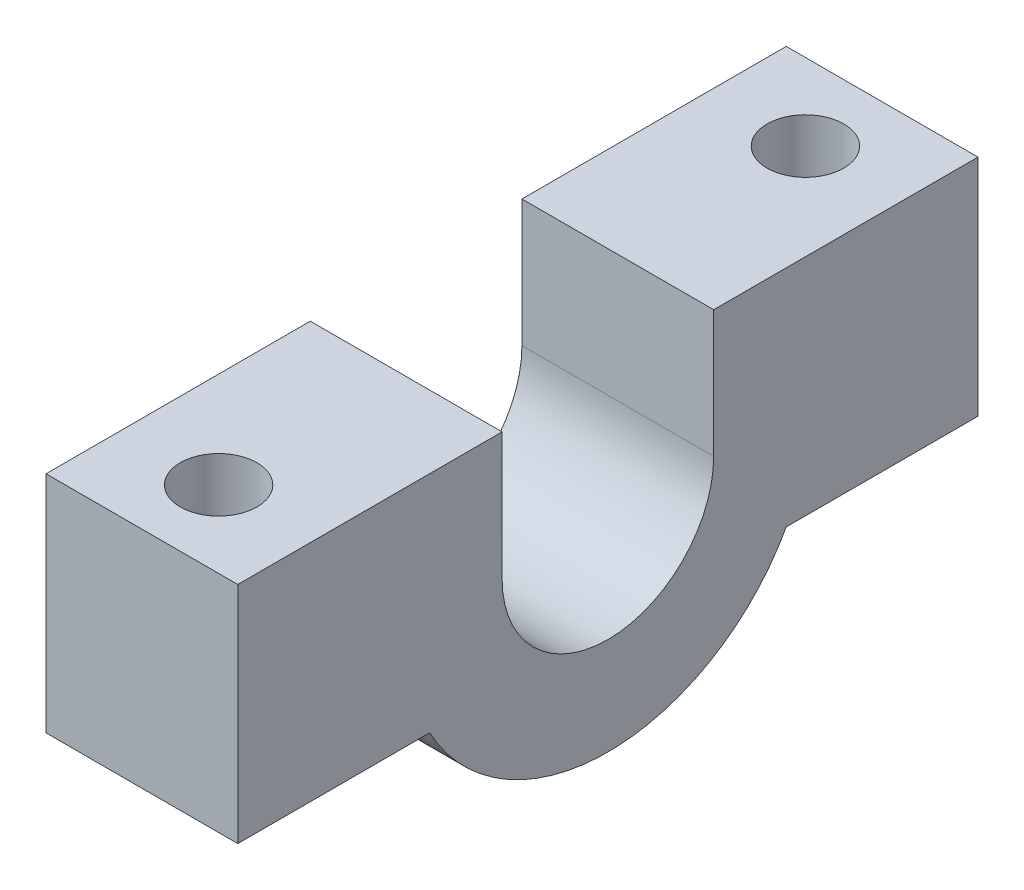
ISO-10303-21;
HEADER;
FILE_DESCRIPTION(('STEP AP214'),'2;1');
FILE_NAME('part.step','',(''),(''),'','','');
FILE_SCHEMA(('AUTOMOTIVE_DESIGN { 1 0 10303 214 1 1 1 1 }'));
ENDSEC;
DATA;
#1=APPLICATION_CONTEXT('core data for automotive mechanical design processes');
#2=APPLICATION_PROTOCOL_DEFINITION('international standard','automotive_design',2000,#1);
#3=PRODUCT_CONTEXT('',#1,'mechanical');
#4=PRODUCT('Part','Part','',(#3));
#5=PRODUCT_RELATED_PRODUCT_CATEGORY('part','',(#4));
#6=PRODUCT_DEFINITION_FORMATION('','',#4);
#7=PRODUCT_DEFINITION_CONTEXT('part definition',#1,'design');
#8=PRODUCT_DEFINITION('design','',#6,#7);
#9=PRODUCT_DEFINITION_SHAPE('','',#8);
#10=(LENGTH_UNIT() NAMED_UNIT(*) SI_UNIT(.MILLI.,.METRE.));
#11=(NAMED_UNIT(*) PLANE_ANGLE_UNIT() SI_UNIT($,.RADIAN.));
#12=(NAMED_UNIT(*) SI_UNIT($,.STERADIAN.) SOLID_ANGLE_UNIT());
#13=UNCERTAINTY_MEASURE_WITH_UNIT(LENGTH_MEASURE(1.E-05),#10,'distance_accuracy_value','');
#14=(GEOMETRIC_REPRESENTATION_CONTEXT(3) GLOBAL_UNCERTAINTY_ASSIGNED_CONTEXT((#13)) GLOBAL_UNIT_ASSIGNED_CONTEXT((#10,
#11,#12)) REPRESENTATION_CONTEXT('',''));
#15=CARTESIAN_POINT('',(0.,0.,0.));
#16=DIRECTION('',(0.,0.,1.));
#17=DIRECTION('',(1.,0.,0.));
#18=AXIS2_PLACEMENT_3D('',#15,#16,#17);
#19=CARTESIAN_POINT('',(20.,0.,0.));
#20=DIRECTION('',(-1.,0.,0.));
#21=DIRECTION('',(0.,0.,1.));
#22=AXIS2_PLACEMENT_3D('',#19,#20,#21);
#23=CYLINDRICAL_SURFACE('',#22,11.035);
#24=CARTESIAN_POINT('',(0.,0.,0.));
#25=DIRECTION('',(-1.,0.,0.));
#26=DIRECTION('',(0.,0.,-1.));
#27=AXIS2_PLACEMENT_3D('',#24,#25,#26);
#28=CIRCLE('',#27,11.035);
#29=CARTESIAN_POINT('',(0.,0.,-11.035));
#30=VERTEX_POINT('',#29);
#31=CARTESIAN_POINT('',(0.,0.,11.035));
#32=VERTEX_POINT('',#31);
#33=EDGE_CURVE('E158',#30,#32,#28,.T.);
#34=ORIENTED_EDGE('',*,*,#33,.T.);
#35=DIRECTION('',(-1.,0.,0.));
#36=VECTOR('',#35,1.);
#37=CARTESIAN_POINT('',(20.,0.,11.035));
#38=LINE('',#37,#36);
#39=CARTESIAN_POINT('',(20.,0.,11.035));
#40=VERTEX_POINT('',#39);
#41=EDGE_CURVE('E11',#40,#32,#38,.T.);
#42=ORIENTED_EDGE('',*,*,#41,.F.);
#43=CARTESIAN_POINT('',(20.,0.,0.));
#44=DIRECTION('',(-1.,0.,0.));
#45=DIRECTION('',(0.,0.,-1.));
#46=AXIS2_PLACEMENT_3D('',#43,#44,#45);
#47=CIRCLE('',#46,11.035);
#48=CARTESIAN_POINT('',(20.,0.,-11.035));
#49=VERTEX_POINT('',#48);
#50=EDGE_CURVE('E188',#49,#40,#47,.T.);
#51=ORIENTED_EDGE('',*,*,#50,.F.);
#52=DIRECTION('',(-1.,0.,0.));
#53=VECTOR('',#52,1.);
#54=CARTESIAN_POINT('',(20.,0.,-11.035));
#55=LINE('',#54,#53);
#56=EDGE_CURVE('E154',#49,#30,#55,.T.);
#57=ORIENTED_EDGE('',*,*,#56,.T.);
#58=EDGE_LOOP('',(#34,#42,#51,#57));
#59=FACE_BOUND('',#58,.T.);
#60=ADVANCED_FACE('F45',(#59),#23,.F.);
#61=CARTESIAN_POINT('',(20.,13.245,11.035));
#62=DIRECTION('',(0.,0.,1.));
#63=DIRECTION('',(1.,0.,0.));
#64=AXIS2_PLACEMENT_3D('',#61,#62,#63);
#65=PLANE('',#64);
#66=DIRECTION('',(0.,1.,0.));
#67=VECTOR('',#66,1.);
#68=CARTESIAN_POINT('',(0.,13.245,11.035));
#69=LINE('',#68,#67);
#70=CARTESIAN_POINT('',(0.,13.245,11.035));
#71=VERTEX_POINT('',#70);
#72=EDGE_CURVE('E162',#32,#71,#69,.T.);
#73=ORIENTED_EDGE('',*,*,#72,.T.);
#74=DIRECTION('',(-1.,0.,0.));
#75=VECTOR('',#74,1.);
#76=CARTESIAN_POINT('',(20.,13.245,11.035));
#77=LINE('',#76,#75);
#78=CARTESIAN_POINT('',(20.,13.245,11.035));
#79=VERTEX_POINT('',#78);
#80=EDGE_CURVE('E54',#79,#71,#77,.T.);
#81=ORIENTED_EDGE('',*,*,#80,.F.);
#82=DIRECTION('',(0.,1.,0.));
#83=VECTOR('',#82,1.);
#84=CARTESIAN_POINT('',(20.,13.245,11.035));
#85=LINE('',#84,#83);
#86=EDGE_CURVE('E111',#40,#79,#85,.T.);
#87=ORIENTED_EDGE('',*,*,#86,.F.);
#88=ORIENTED_EDGE('',*,*,#41,.T.);
#89=EDGE_LOOP('',(#73,#81,#87,#88));
#90=FACE_BOUND('',#89,.T.);
#91=ADVANCED_FACE('F269',(#90),#65,.F.);
#92=CARTESIAN_POINT('',(20.,13.245,38.6011404220279));
#93=DIRECTION('',(0.,-1.,0.));
#94=DIRECTION('',(0.,0.,-1.));
#95=AXIS2_PLACEMENT_3D('',#92,#93,#94);
#96=PLANE('',#95);
#97=CARTESIAN_POINT('',(10.,13.245,30.6));
#98=DIRECTION('',(0.,1.,0.));
#99=DIRECTION('',(0.,0.,1.));
#100=AXIS2_PLACEMENT_3D('',#97,#98,#99);
#101=CIRCLE('',#100,4.);
#102=CARTESIAN_POINT('',(10.,13.245,34.6));
#103=VERTEX_POINT('',#102);
#104=EDGE_CURVE('E253',#103,#103,#101,.T.);
#105=ORIENTED_EDGE('',*,*,#104,.F.);
#106=EDGE_LOOP('',(#105));
#107=FACE_BOUND('',#106,.T.);
#108=DIRECTION('',(0.,0.,1.));
#109=VECTOR('',#108,1.);
#110=CARTESIAN_POINT('',(0.,13.245,38.6011404220279));
#111=LINE('',#110,#109);
#112=CARTESIAN_POINT('',(0.,13.245,38.6011404220279));
#113=VERTEX_POINT('',#112);
#114=EDGE_CURVE('E166',#71,#113,#111,.T.);
#115=ORIENTED_EDGE('',*,*,#114,.T.);
#116=DIRECTION('',(-1.,0.,0.));
#117=VECTOR('',#116,1.);
#118=CARTESIAN_POINT('',(20.,13.245,38.6011404220279));
#119=LINE('',#118,#117);
#120=CARTESIAN_POINT('',(20.,13.245,38.6011404220279));
#121=VERTEX_POINT('',#120);
#122=EDGE_CURVE('E207',#121,#113,#119,.T.);
#123=ORIENTED_EDGE('',*,*,#122,.F.);
#124=DIRECTION('',(0.,0.,1.));
#125=VECTOR('',#124,1.);
#126=CARTESIAN_POINT('',(20.,13.245,38.6011404220279));
#127=LINE('',#126,#125);
#128=EDGE_CURVE('E217',#79,#121,#127,.T.);
#129=ORIENTED_EDGE('',*,*,#128,.F.);
#130=ORIENTED_EDGE('',*,*,#80,.T.);
#131=EDGE_LOOP('',(#115,#123,#129,#130));
#132=FACE_BOUND('',#131,.T.);
#133=ADVANCED_FACE('F215',(#107,#132),#96,.F.);
#134=CARTESIAN_POINT('',(20.,0.,38.6011404220279));
#135=DIRECTION('',(0.,0.,-1.));
#136=DIRECTION('',(-1.,0.,0.));
#137=AXIS2_PLACEMENT_3D('',#134,#135,#136);
#138=PLANE('',#137);
#139=DIRECTION('',(0.,-1.,0.));
#140=VECTOR('',#139,1.);
#141=CARTESIAN_POINT('',(0.,0.,38.6011404220279));
#142=LINE('',#141,#140);
#143=CARTESIAN_POINT('',(0.,-10.16,38.6011404220279));
#144=VERTEX_POINT('',#143);
#145=EDGE_CURVE('E170',#113,#144,#142,.T.);
#146=ORIENTED_EDGE('',*,*,#145,.T.);
#147=DIRECTION('',(-1.,0.,0.));
#148=VECTOR('',#147,1.);
#149=CARTESIAN_POINT('',(20.,-10.16,38.6011404220279));
#150=LINE('',#149,#148);
#151=CARTESIAN_POINT('',(20.,-10.16,38.6011404220279));
#152=VERTEX_POINT('',#151);
#153=EDGE_CURVE('E203',#152,#144,#150,.T.);
#154=ORIENTED_EDGE('',*,*,#153,.F.);
#155=DIRECTION('',(0.,-1.,0.));
#156=VECTOR('',#155,1.);
#157=CARTESIAN_POINT('',(20.,0.,38.6011404220279));
#158=LINE('',#157,#156);
#159=EDGE_CURVE('E235',#121,#152,#158,.T.);
#160=ORIENTED_EDGE('',*,*,#159,.F.);
#161=ORIENTED_EDGE('',*,*,#122,.T.);
#162=EDGE_LOOP('',(#146,#154,#160,#161));
#163=FACE_BOUND('',#162,.T.);
#164=ADVANCED_FACE('F225',(#163),#138,.F.);
#165=CARTESIAN_POINT('',(20.,-10.16,18.6011404220279));
#166=DIRECTION('',(0.,1.,0.));
#167=DIRECTION('',(0.,0.,1.));
#168=AXIS2_PLACEMENT_3D('',#165,#166,#167);
#169=PLANE('',#168);
#170=CARTESIAN_POINT('',(10.,-10.16,30.6));
#171=DIRECTION('',(0.,1.,0.));
#172=DIRECTION('',(0.,0.,1.));
#173=AXIS2_PLACEMENT_3D('',#170,#171,#172);
#174=CIRCLE('',#173,4.);
#175=CARTESIAN_POINT('',(10.,-10.16,34.6));
#176=VERTEX_POINT('',#175);
#177=EDGE_CURVE('E163',#176,#176,#174,.F.);
#178=ORIENTED_EDGE('',*,*,#177,.F.);
#179=EDGE_LOOP('',(#178));
#180=FACE_BOUND('',#179,.T.);
#181=DIRECTION('',(0.,0.,-1.));
#182=VECTOR('',#181,1.);
#183=CARTESIAN_POINT('',(0.,-10.16,18.6011404220279));
#184=LINE('',#183,#182);
#185=CARTESIAN_POINT('',(0.,-10.16,18.6011404220279));
#186=VERTEX_POINT('',#185);
#187=EDGE_CURVE('E173',#144,#186,#184,.T.);
#188=ORIENTED_EDGE('',*,*,#187,.T.);
#189=DIRECTION('',(-1.,0.,0.));
#190=VECTOR('',#189,1.);
#191=CARTESIAN_POINT('',(20.,-10.16,18.6011404220279));
#192=LINE('',#191,#190);
#193=CARTESIAN_POINT('',(20.,-10.16,18.6011404220279));
#194=VERTEX_POINT('',#193);
#195=EDGE_CURVE('E199',#194,#186,#192,.T.);
#196=ORIENTED_EDGE('',*,*,#195,.F.);
#197=DIRECTION('',(0.,0.,-1.));
#198=VECTOR('',#197,1.);
#199=CARTESIAN_POINT('',(20.,-10.16,18.6011404220279));
#200=LINE('',#199,#198);
#201=EDGE_CURVE('E231',#152,#194,#200,.T.);
#202=ORIENTED_EDGE('',*,*,#201,.F.);
#203=ORIENTED_EDGE('',*,*,#153,.T.);
#204=EDGE_LOOP('',(#188,#196,#202,#203));
#205=FACE_BOUND('',#204,.T.);
#206=ADVANCED_FACE('F229',(#180,#205),#169,.F.);
#207=CARTESIAN_POINT('',(20.,0.,0.));
#208=DIRECTION('',(-1.,0.,0.));
#209=DIRECTION('',(0.,0.,1.));
#210=AXIS2_PLACEMENT_3D('',#207,#208,#209);
#211=CYLINDRICAL_SURFACE('',#210,21.195);
#212=CARTESIAN_POINT('',(0.,0.,0.));
#213=DIRECTION('',(1.,0.,0.));
#214=DIRECTION('',(0.,0.,-1.));
#215=AXIS2_PLACEMENT_3D('',#212,#213,#214);
#216=CIRCLE('',#215,21.195);
#217=CARTESIAN_POINT('',(0.,-10.16,-18.6011404220279));
#218=VERTEX_POINT('',#217);
#219=EDGE_CURVE('E176',#186,#218,#216,.T.);
#220=ORIENTED_EDGE('',*,*,#219,.T.);
#221=DIRECTION('',(-1.,0.,0.));
#222=VECTOR('',#221,1.);
#223=CARTESIAN_POINT('',(20.,-10.16,-18.6011404220279));
#224=LINE('',#223,#222);
#225=CARTESIAN_POINT('',(20.,-10.16,-18.6011404220279));
#226=VERTEX_POINT('',#225);
#227=EDGE_CURVE('E195',#226,#218,#224,.T.);
#228=ORIENTED_EDGE('',*,*,#227,.F.);
#229=CARTESIAN_POINT('',(20.,0.,0.));
#230=DIRECTION('',(1.,0.,0.));
#231=DIRECTION('',(0.,0.,-1.));
#232=AXIS2_PLACEMENT_3D('',#229,#230,#231);
#233=CIRCLE('',#232,21.195);
#234=EDGE_CURVE('E234',#194,#226,#233,.T.);
#235=ORIENTED_EDGE('',*,*,#234,.F.);
#236=ORIENTED_EDGE('',*,*,#195,.T.);
#237=EDGE_LOOP('',(#220,#228,#235,#236));
#238=FACE_BOUND('',#237,.T.);
#239=ADVANCED_FACE('F287',(#238),#211,.T.);
#240=CARTESIAN_POINT('',(20.,-10.16,-38.6011404220279));
#241=DIRECTION('',(0.,1.,0.));
#242=DIRECTION('',(0.,0.,1.));
#243=AXIS2_PLACEMENT_3D('',#240,#241,#242);
#244=PLANE('',#243);
#245=CARTESIAN_POINT('',(10.,-10.16,-30.6));
#246=DIRECTION('',(0.,1.,0.));
#247=DIRECTION('',(0.,0.,1.));
#248=AXIS2_PLACEMENT_3D('',#245,#246,#247);
#249=CIRCLE('',#248,4.);
#250=CARTESIAN_POINT('',(10.,-10.16,-26.6));
#251=VERTEX_POINT('',#250);
#252=EDGE_CURVE('E254',#251,#251,#249,.F.);
#253=ORIENTED_EDGE('',*,*,#252,.F.);
#254=EDGE_LOOP('',(#253));
#255=FACE_BOUND('',#254,.T.);
#256=DIRECTION('',(0.,0.,-1.));
#257=VECTOR('',#256,1.);
#258=CARTESIAN_POINT('',(0.,-10.16,-38.6011404220279));
#259=LINE('',#258,#257);
#260=CARTESIAN_POINT('',(0.,-10.16,-38.6011404220279));
#261=VERTEX_POINT('',#260);
#262=EDGE_CURVE('E179',#218,#261,#259,.T.);
#263=ORIENTED_EDGE('',*,*,#262,.T.);
#264=DIRECTION('',(-1.,0.,0.));
#265=VECTOR('',#264,1.);
#266=CARTESIAN_POINT('',(20.,-10.16,-38.6011404220279));
#267=LINE('',#266,#265);
#268=CARTESIAN_POINT('',(20.,-10.16,-38.6011404220279));
#269=VERTEX_POINT('',#268);
#270=EDGE_CURVE('E147',#269,#261,#267,.T.);
#271=ORIENTED_EDGE('',*,*,#270,.F.);
#272=DIRECTION('',(0.,0.,-1.));
#273=VECTOR('',#272,1.);
#274=CARTESIAN_POINT('',(20.,-10.16,-38.6011404220279));
#275=LINE('',#274,#273);
#276=EDGE_CURVE('E136',#226,#269,#275,.T.);
#277=ORIENTED_EDGE('',*,*,#276,.F.);
#278=ORIENTED_EDGE('',*,*,#227,.T.);
#279=EDGE_LOOP('',(#263,#271,#277,#278));
#280=FACE_BOUND('',#279,.T.);
#281=ADVANCED_FACE('F284',(#255,#280),#244,.F.);
#282=CARTESIAN_POINT('',(20.,13.245,-38.6011404220279));
#283=DIRECTION('',(0.,0.,1.));
#284=DIRECTION('',(1.,0.,0.));
#285=AXIS2_PLACEMENT_3D('',#282,#283,#284);
#286=PLANE('',#285);
#287=DIRECTION('',(0.,1.,0.));
#288=VECTOR('',#287,1.);
#289=CARTESIAN_POINT('',(0.,13.245,-38.6011404220279));
#290=LINE('',#289,#288);
#291=CARTESIAN_POINT('',(0.,13.245,-38.6011404220279));
#292=VERTEX_POINT('',#291);
#293=EDGE_CURVE('E145',#261,#292,#290,.T.);
#294=ORIENTED_EDGE('',*,*,#293,.T.);
#295=DIRECTION('',(-1.,0.,0.));
#296=VECTOR('',#295,1.);
#297=CARTESIAN_POINT('',(20.,13.245,-38.6011404220279));
#298=LINE('',#297,#296);
#299=CARTESIAN_POINT('',(20.,13.245,-38.6011404220279));
#300=VERTEX_POINT('',#299);
#301=EDGE_CURVE('E142',#300,#292,#298,.T.);
#302=ORIENTED_EDGE('',*,*,#301,.F.);
#303=DIRECTION('',(0.,1.,0.));
#304=VECTOR('',#303,1.);
#305=CARTESIAN_POINT('',(20.,13.245,-38.6011404220279));
#306=LINE('',#305,#304);
#307=EDGE_CURVE('E130',#269,#300,#306,.T.);
#308=ORIENTED_EDGE('',*,*,#307,.F.);
#309=ORIENTED_EDGE('',*,*,#270,.T.);
#310=EDGE_LOOP('',(#294,#302,#308,#309));
#311=FACE_BOUND('',#310,.T.);
#312=ADVANCED_FACE('F143',(#311),#286,.F.);
#313=CARTESIAN_POINT('',(20.,13.245,-11.035));
#314=DIRECTION('',(0.,-1.,0.));
#315=DIRECTION('',(0.,0.,-1.));
#316=AXIS2_PLACEMENT_3D('',#313,#314,#315);
#317=PLANE('',#316);
#318=CARTESIAN_POINT('',(10.,13.245,-30.6));
#319=DIRECTION('',(0.,1.,0.));
#320=DIRECTION('',(0.,0.,1.));
#321=AXIS2_PLACEMENT_3D('',#318,#319,#320);
#322=CIRCLE('',#321,4.);
#323=CARTESIAN_POINT('',(10.,13.245,-26.6));
#324=VERTEX_POINT('',#323);
#325=EDGE_CURVE('E249',#324,#324,#322,.T.);
#326=ORIENTED_EDGE('',*,*,#325,.F.);
#327=EDGE_LOOP('',(#326));
#328=FACE_BOUND('',#327,.T.);
#329=DIRECTION('',(0.,0.,1.));
#330=VECTOR('',#329,1.);
#331=CARTESIAN_POINT('',(0.,13.245,-11.035));
#332=LINE('',#331,#330);
#333=CARTESIAN_POINT('',(0.,13.245,-11.035));
#334=VERTEX_POINT('',#333);
#335=EDGE_CURVE('E97',#292,#334,#332,.T.);
#336=ORIENTED_EDGE('',*,*,#335,.T.);
#337=DIRECTION('',(-1.,0.,0.));
#338=VECTOR('',#337,1.);
#339=CARTESIAN_POINT('',(20.,13.245,-11.035));
#340=LINE('',#339,#338);
#341=CARTESIAN_POINT('',(20.,13.245,-11.035));
#342=VERTEX_POINT('',#341);
#343=EDGE_CURVE('E148',#342,#334,#340,.T.);
#344=ORIENTED_EDGE('',*,*,#343,.F.);
#345=DIRECTION('',(0.,0.,1.));
#346=VECTOR('',#345,1.);
#347=CARTESIAN_POINT('',(20.,13.245,-11.035));
#348=LINE('',#347,#346);
#349=EDGE_CURVE('E134',#300,#342,#348,.T.);
#350=ORIENTED_EDGE('',*,*,#349,.F.);
#351=ORIENTED_EDGE('',*,*,#301,.T.);
#352=EDGE_LOOP('',(#336,#344,#350,#351));
#353=FACE_BOUND('',#352,.T.);
#354=ADVANCED_FACE('F150',(#328,#353),#317,.F.);
#355=CARTESIAN_POINT('',(20.,0.,-11.035));
#356=DIRECTION('',(0.,0.,-1.));
#357=DIRECTION('',(-1.,0.,0.));
#358=AXIS2_PLACEMENT_3D('',#355,#356,#357);
#359=PLANE('',#358);
#360=DIRECTION('',(0.,-1.,0.));
#361=VECTOR('',#360,1.);
#362=CARTESIAN_POINT('',(0.,0.,-11.035));
#363=LINE('',#362,#361);
#364=EDGE_CURVE('E103',#334,#30,#363,.T.);
#365=ORIENTED_EDGE('',*,*,#364,.T.);
#366=ORIENTED_EDGE('',*,*,#56,.F.);
#367=DIRECTION('',(0.,-1.,0.));
#368=VECTOR('',#367,1.);
#369=CARTESIAN_POINT('',(20.,0.,-11.035));
#370=LINE('',#369,#368);
#371=EDGE_CURVE('E62',#342,#49,#370,.T.);
#372=ORIENTED_EDGE('',*,*,#371,.F.);
#373=ORIENTED_EDGE('',*,*,#343,.T.);
#374=EDGE_LOOP('',(#365,#366,#372,#373));
#375=FACE_BOUND('',#374,.T.);
#376=ADVANCED_FACE('F303',(#375),#359,.F.);
#377=CARTESIAN_POINT('',(20.,0.,0.));
#378=DIRECTION('',(1.,0.,0.));
#379=DIRECTION('',(0.,0.,-1.));
#380=AXIS2_PLACEMENT_3D('',#377,#378,#379);
#381=PLANE('',#380);
#382=ORIENTED_EDGE('',*,*,#50,.T.);
#383=ORIENTED_EDGE('',*,*,#86,.T.);
#384=ORIENTED_EDGE('',*,*,#128,.T.);
#385=ORIENTED_EDGE('',*,*,#159,.T.);
#386=ORIENTED_EDGE('',*,*,#201,.T.);
#387=ORIENTED_EDGE('',*,*,#234,.T.);
#388=ORIENTED_EDGE('',*,*,#276,.T.);
#389=ORIENTED_EDGE('',*,*,#307,.T.);
#390=ORIENTED_EDGE('',*,*,#349,.T.);
#391=ORIENTED_EDGE('',*,*,#371,.T.);
#392=EDGE_LOOP('',(#382,#383,#384,#385,#386,#387,#388,#389,#390,#391));
#393=FACE_BOUND('',#392,.T.);
#394=ADVANCED_FACE('F132',(#393),#381,.T.);
#395=CARTESIAN_POINT('',(0.,0.,0.));
#396=DIRECTION('',(1.,0.,0.));
#397=DIRECTION('',(0.,0.,-1.));
#398=AXIS2_PLACEMENT_3D('',#395,#396,#397);
#399=PLANE('',#398);
#400=ORIENTED_EDGE('',*,*,#33,.F.);
#401=ORIENTED_EDGE('',*,*,#364,.F.);
#402=ORIENTED_EDGE('',*,*,#335,.F.);
#403=ORIENTED_EDGE('',*,*,#293,.F.);
#404=ORIENTED_EDGE('',*,*,#262,.F.);
#405=ORIENTED_EDGE('',*,*,#219,.F.);
#406=ORIENTED_EDGE('',*,*,#187,.F.);
#407=ORIENTED_EDGE('',*,*,#145,.F.);
#408=ORIENTED_EDGE('',*,*,#114,.F.);
#409=ORIENTED_EDGE('',*,*,#72,.F.);
#410=EDGE_LOOP('',(#400,#401,#402,#403,#404,#405,#406,#407,#408,#409));
#411=FACE_BOUND('',#410,.T.);
#412=ADVANCED_FACE('F220',(#411),#399,.F.);
#413=CARTESIAN_POINT('',(10.,-21.196,-30.6));
#414=DIRECTION('',(0.,1.,0.));
#415=DIRECTION('',(0.,0.,1.));
#416=AXIS2_PLACEMENT_3D('',#413,#414,#415);
#417=CYLINDRICAL_SURFACE('',#416,4.);
#418=ORIENTED_EDGE('',*,*,#325,.T.);
#419=EDGE_LOOP('',(#418));
#420=FACE_BOUND('',#419,.T.);
#421=ORIENTED_EDGE('',*,*,#252,.T.);
#422=EDGE_LOOP('',(#421));
#423=FACE_BOUND('',#422,.T.);
#424=ADVANCED_FACE('F309',(#420,#423),#417,.F.);
#425=CARTESIAN_POINT('',(10.,-21.196,30.6));
#426=DIRECTION('',(0.,1.,0.));
#427=DIRECTION('',(0.,0.,1.));
#428=AXIS2_PLACEMENT_3D('',#425,#426,#427);
#429=CYLINDRICAL_SURFACE('',#428,4.);
#430=ORIENTED_EDGE('',*,*,#104,.T.);
#431=EDGE_LOOP('',(#430));
#432=FACE_BOUND('',#431,.T.);
#433=ORIENTED_EDGE('',*,*,#177,.T.);
#434=EDGE_LOOP('',(#433));
#435=FACE_BOUND('',#434,.T.);
#436=ADVANCED_FACE('F265',(#432,#435),#429,.F.);
#437=CLOSED_SHELL('',(#60,#91,#133,#164,#206,#239,#281,#312,#354,#376,#394,#412,#424,#436));
#438=MANIFOLD_SOLID_BREP('B2',#437);
#439=ADVANCED_BREP_SHAPE_REPRESENTATION('',(#18,#438),#14);
#440=SHAPE_DEFINITION_REPRESENTATION(#9,#439);
ENDSEC;
END-ISO-10303-21;
